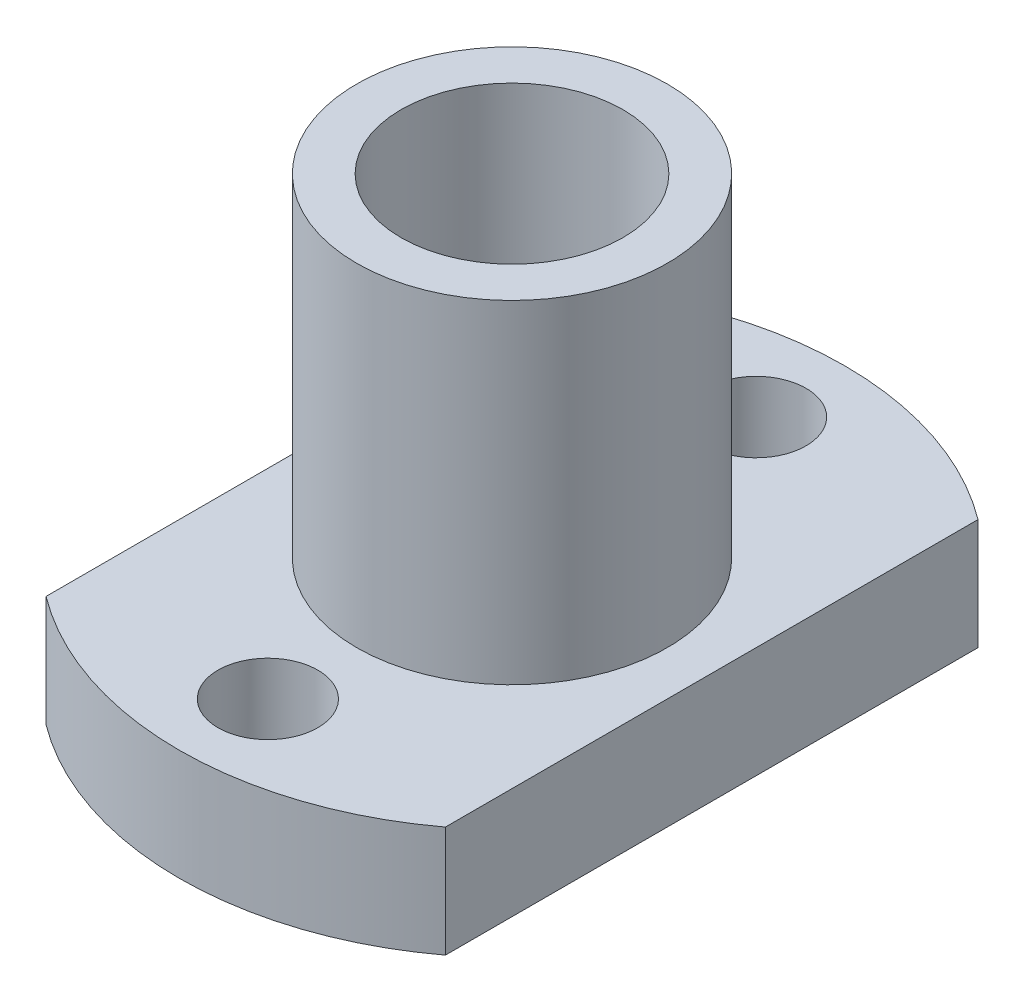
ISO-10303-21;
HEADER;
FILE_DESCRIPTION(('STEP AP214'),'2;1');
FILE_NAME('part.step','',(''),(''),'','','');
FILE_SCHEMA(('AUTOMOTIVE_DESIGN { 1 0 10303 214 1 1 1 1 }'));
ENDSEC;
DATA;
#1=APPLICATION_CONTEXT('core data for automotive mechanical design processes');
#2=APPLICATION_PROTOCOL_DEFINITION('international standard','automotive_design',2000,#1);
#3=PRODUCT_CONTEXT('',#1,'mechanical');
#4=PRODUCT('Part','Part','',(#3));
#5=PRODUCT_RELATED_PRODUCT_CATEGORY('part','',(#4));
#6=PRODUCT_DEFINITION_FORMATION('','',#4);
#7=PRODUCT_DEFINITION_CONTEXT('part definition',#1,'design');
#8=PRODUCT_DEFINITION('design','',#6,#7);
#9=PRODUCT_DEFINITION_SHAPE('','',#8);
#10=(LENGTH_UNIT() NAMED_UNIT(*) SI_UNIT(.MILLI.,.METRE.));
#11=(NAMED_UNIT(*) PLANE_ANGLE_UNIT() SI_UNIT($,.RADIAN.));
#12=(NAMED_UNIT(*) SI_UNIT($,.STERADIAN.) SOLID_ANGLE_UNIT());
#13=UNCERTAINTY_MEASURE_WITH_UNIT(LENGTH_MEASURE(1.E-05),#10,'distance_accuracy_value','');
#14=(GEOMETRIC_REPRESENTATION_CONTEXT(3) GLOBAL_UNCERTAINTY_ASSIGNED_CONTEXT((#13)) GLOBAL_UNIT_ASSIGNED_CONTEXT((#10,
#11,#12)) REPRESENTATION_CONTEXT('',''));
#15=CARTESIAN_POINT('',(0.,0.,0.));
#16=DIRECTION('',(0.,0.,1.));
#17=DIRECTION('',(1.,0.,0.));
#18=AXIS2_PLACEMENT_3D('',#15,#16,#17);
#19=CARTESIAN_POINT('',(0.,5.,0.));
#20=DIRECTION('',(0.,-1.,0.));
#21=DIRECTION('',(0.,0.,-1.));
#22=AXIS2_PLACEMENT_3D('',#19,#20,#21);
#23=CYLINDRICAL_SURFACE('',#22,15.);
#24=CARTESIAN_POINT('',(0.,0.,0.));
#25=DIRECTION('',(0.,1.,0.));
#26=DIRECTION('',(0.,0.,-1.));
#27=AXIS2_PLACEMENT_3D('',#24,#25,#26);
#28=CIRCLE('',#27,15.);
#29=CARTESIAN_POINT('',(9.,0.,-12.));
#30=VERTEX_POINT('',#29);
#31=CARTESIAN_POINT('',(-9.,0.,-12.));
#32=VERTEX_POINT('',#31);
#33=EDGE_CURVE('E107',#30,#32,#28,.T.);
#34=ORIENTED_EDGE('',*,*,#33,.T.);
#35=DIRECTION('',(0.,-1.,0.));
#36=VECTOR('',#35,1.);
#37=CARTESIAN_POINT('',(-9.,5.,-12.));
#38=LINE('',#37,#36);
#39=CARTESIAN_POINT('',(-9.,5.,-12.));
#40=VERTEX_POINT('',#39);
#41=EDGE_CURVE('E48',#40,#32,#38,.T.);
#42=ORIENTED_EDGE('',*,*,#41,.F.);
#43=CARTESIAN_POINT('',(0.,5.,0.));
#44=DIRECTION('',(0.,1.,0.));
#45=DIRECTION('',(0.,0.,-1.));
#46=AXIS2_PLACEMENT_3D('',#43,#44,#45);
#47=CIRCLE('',#46,15.);
#48=CARTESIAN_POINT('',(9.,5.,-12.));
#49=VERTEX_POINT('',#48);
#50=EDGE_CURVE('E93',#49,#40,#47,.T.);
#51=ORIENTED_EDGE('',*,*,#50,.F.);
#52=DIRECTION('',(0.,-1.,0.));
#53=VECTOR('',#52,1.);
#54=CARTESIAN_POINT('',(9.,5.,-12.));
#55=LINE('',#54,#53);
#56=EDGE_CURVE('E103',#49,#30,#55,.T.);
#57=ORIENTED_EDGE('',*,*,#56,.T.);
#58=EDGE_LOOP('',(#34,#42,#51,#57));
#59=FACE_BOUND('',#58,.T.);
#60=ADVANCED_FACE('F39',(#59),#23,.T.);
#61=CARTESIAN_POINT('',(-9.,5.,-12.));
#62=DIRECTION('',(1.,0.,0.));
#63=DIRECTION('',(0.,0.,-1.));
#64=AXIS2_PLACEMENT_3D('',#61,#62,#63);
#65=PLANE('',#64);
#66=DIRECTION('',(0.,0.,1.));
#67=VECTOR('',#66,1.);
#68=CARTESIAN_POINT('',(-9.,0.,-12.));
#69=LINE('',#68,#67);
#70=CARTESIAN_POINT('',(-9.,0.,12.));
#71=VERTEX_POINT('',#70);
#72=EDGE_CURVE('E98',#32,#71,#69,.T.);
#73=ORIENTED_EDGE('',*,*,#72,.T.);
#74=DIRECTION('',(0.,-1.,0.));
#75=VECTOR('',#74,1.);
#76=CARTESIAN_POINT('',(-9.,5.,12.));
#77=LINE('',#76,#75);
#78=CARTESIAN_POINT('',(-9.,5.,12.));
#79=VERTEX_POINT('',#78);
#80=EDGE_CURVE('E96',#79,#71,#77,.T.);
#81=ORIENTED_EDGE('',*,*,#80,.F.);
#82=DIRECTION('',(0.,0.,1.));
#83=VECTOR('',#82,1.);
#84=CARTESIAN_POINT('',(-9.,5.,-12.));
#85=LINE('',#84,#83);
#86=EDGE_CURVE('E88',#40,#79,#85,.T.);
#87=ORIENTED_EDGE('',*,*,#86,.F.);
#88=ORIENTED_EDGE('',*,*,#41,.T.);
#89=EDGE_LOOP('',(#73,#81,#87,#88));
#90=FACE_BOUND('',#89,.T.);
#91=ADVANCED_FACE('F97',(#90),#65,.F.);
#92=CARTESIAN_POINT('',(0.,5.,0.));
#93=DIRECTION('',(0.,-1.,0.));
#94=DIRECTION('',(0.,0.,-1.));
#95=AXIS2_PLACEMENT_3D('',#92,#93,#94);
#96=CYLINDRICAL_SURFACE('',#95,15.);
#97=CARTESIAN_POINT('',(0.,0.,0.));
#98=DIRECTION('',(0.,1.,0.));
#99=DIRECTION('',(0.,0.,1.));
#100=AXIS2_PLACEMENT_3D('',#97,#98,#99);
#101=CIRCLE('',#100,15.);
#102=CARTESIAN_POINT('',(9.,0.,12.));
#103=VERTEX_POINT('',#102);
#104=EDGE_CURVE('E74',#71,#103,#101,.T.);
#105=ORIENTED_EDGE('',*,*,#104,.T.);
#106=DIRECTION('',(0.,-1.,0.));
#107=VECTOR('',#106,1.);
#108=CARTESIAN_POINT('',(9.,5.,12.));
#109=LINE('',#108,#107);
#110=CARTESIAN_POINT('',(9.,5.,12.));
#111=VERTEX_POINT('',#110);
#112=EDGE_CURVE('E99',#111,#103,#109,.T.);
#113=ORIENTED_EDGE('',*,*,#112,.F.);
#114=CARTESIAN_POINT('',(0.,5.,0.));
#115=DIRECTION('',(0.,1.,0.));
#116=DIRECTION('',(0.,0.,1.));
#117=AXIS2_PLACEMENT_3D('',#114,#115,#116);
#118=CIRCLE('',#117,15.);
#119=EDGE_CURVE('E91',#79,#111,#118,.T.);
#120=ORIENTED_EDGE('',*,*,#119,.F.);
#121=ORIENTED_EDGE('',*,*,#80,.T.);
#122=EDGE_LOOP('',(#105,#113,#120,#121));
#123=FACE_BOUND('',#122,.T.);
#124=ADVANCED_FACE('F101',(#123),#96,.T.);
#125=CARTESIAN_POINT('',(9.,5.,-12.));
#126=DIRECTION('',(-1.,0.,0.));
#127=DIRECTION('',(0.,0.,1.));
#128=AXIS2_PLACEMENT_3D('',#125,#126,#127);
#129=PLANE('',#128);
#130=DIRECTION('',(0.,0.,-1.));
#131=VECTOR('',#130,1.);
#132=CARTESIAN_POINT('',(9.,0.,-12.));
#133=LINE('',#132,#131);
#134=EDGE_CURVE('E80',#103,#30,#133,.T.);
#135=ORIENTED_EDGE('',*,*,#134,.T.);
#136=ORIENTED_EDGE('',*,*,#56,.F.);
#137=DIRECTION('',(0.,0.,-1.));
#138=VECTOR('',#137,1.);
#139=CARTESIAN_POINT('',(9.,5.,-12.));
#140=LINE('',#139,#138);
#141=EDGE_CURVE('E57',#111,#49,#140,.T.);
#142=ORIENTED_EDGE('',*,*,#141,.F.);
#143=ORIENTED_EDGE('',*,*,#112,.T.);
#144=EDGE_LOOP('',(#135,#136,#142,#143));
#145=FACE_BOUND('',#144,.T.);
#146=ADVANCED_FACE('F149',(#145),#129,.F.);
#147=CARTESIAN_POINT('',(0.,5.,0.));
#148=DIRECTION('',(0.,-1.,0.));
#149=DIRECTION('',(0.,0.,-1.));
#150=AXIS2_PLACEMENT_3D('',#147,#148,#149);
#151=PLANE('',#150);
#152=CARTESIAN_POINT('',(0.,5.,-11.));
#153=DIRECTION('',(0.,1.,0.));
#154=DIRECTION('',(0.,0.,1.));
#155=AXIS2_PLACEMENT_3D('',#152,#153,#154);
#156=CIRCLE('',#155,2.25);
#157=CARTESIAN_POINT('',(0.,5.,-8.75));
#158=VERTEX_POINT('',#157);
#159=EDGE_CURVE('E118',#158,#158,#156,.T.);
#160=ORIENTED_EDGE('',*,*,#159,.F.);
#161=EDGE_LOOP('',(#160));
#162=FACE_BOUND('',#161,.T.);
#163=CARTESIAN_POINT('',(0.,5.,11.));
#164=DIRECTION('',(0.,1.,0.));
#165=DIRECTION('',(0.,0.,1.));
#166=AXIS2_PLACEMENT_3D('',#163,#164,#165);
#167=CIRCLE('',#166,2.25);
#168=CARTESIAN_POINT('',(0.,5.,13.25));
#169=VERTEX_POINT('',#168);
#170=EDGE_CURVE('E124',#169,#169,#167,.T.);
#171=ORIENTED_EDGE('',*,*,#170,.F.);
#172=EDGE_LOOP('',(#171));
#173=FACE_BOUND('',#172,.T.);
#174=CARTESIAN_POINT('',(0.,5.,0.));
#175=DIRECTION('',(0.,1.,0.));
#176=DIRECTION('',(0.,0.,1.));
#177=AXIS2_PLACEMENT_3D('',#174,#175,#176);
#178=CIRCLE('',#177,7.);
#179=CARTESIAN_POINT('',(0.,5.,7.));
#180=VERTEX_POINT('',#179);
#181=EDGE_CURVE('E11',#180,#180,#178,.T.);
#182=ORIENTED_EDGE('',*,*,#181,.F.);
#183=EDGE_LOOP('',(#182));
#184=FACE_BOUND('',#183,.T.);
#185=ORIENTED_EDGE('',*,*,#50,.T.);
#186=ORIENTED_EDGE('',*,*,#86,.T.);
#187=ORIENTED_EDGE('',*,*,#119,.T.);
#188=ORIENTED_EDGE('',*,*,#141,.T.);
#189=EDGE_LOOP('',(#185,#186,#187,#188));
#190=FACE_BOUND('',#189,.T.);
#191=ADVANCED_FACE('F89',(#162,#173,#184,#190),#151,.F.);
#192=CARTESIAN_POINT('',(0.,0.,0.));
#193=DIRECTION('',(0.,-1.,0.));
#194=DIRECTION('',(0.,0.,-1.));
#195=AXIS2_PLACEMENT_3D('',#192,#193,#194);
#196=PLANE('',#195);
#197=CARTESIAN_POINT('',(0.,0.,-11.));
#198=DIRECTION('',(0.,-1.,0.));
#199=DIRECTION('',(0.,0.,-1.));
#200=AXIS2_PLACEMENT_3D('',#197,#198,#199);
#201=CIRCLE('',#200,2.25);
#202=CARTESIAN_POINT('',(0.,0.,-13.25));
#203=VERTEX_POINT('',#202);
#204=EDGE_CURVE('E42',#203,#203,#201,.T.);
#205=ORIENTED_EDGE('',*,*,#204,.F.);
#206=EDGE_LOOP('',(#205));
#207=FACE_BOUND('',#206,.T.);
#208=CARTESIAN_POINT('',(0.,0.,11.));
#209=DIRECTION('',(0.,-1.,0.));
#210=DIRECTION('',(0.,0.,-1.));
#211=AXIS2_PLACEMENT_3D('',#208,#209,#210);
#212=CIRCLE('',#211,2.25);
#213=CARTESIAN_POINT('',(0.,0.,8.75));
#214=VERTEX_POINT('',#213);
#215=EDGE_CURVE('E116',#214,#214,#212,.T.);
#216=ORIENTED_EDGE('',*,*,#215,.F.);
#217=EDGE_LOOP('',(#216));
#218=FACE_BOUND('',#217,.T.);
#219=CARTESIAN_POINT('',(0.,0.,0.));
#220=DIRECTION('',(0.,-1.,0.));
#221=DIRECTION('',(0.,0.,-1.));
#222=AXIS2_PLACEMENT_3D('',#219,#220,#221);
#223=CIRCLE('',#222,5.);
#224=CARTESIAN_POINT('',(0.,0.,-5.));
#225=VERTEX_POINT('',#224);
#226=EDGE_CURVE('E133',#225,#225,#223,.T.);
#227=ORIENTED_EDGE('',*,*,#226,.F.);
#228=EDGE_LOOP('',(#227));
#229=FACE_BOUND('',#228,.T.);
#230=ORIENTED_EDGE('',*,*,#33,.F.);
#231=ORIENTED_EDGE('',*,*,#134,.F.);
#232=ORIENTED_EDGE('',*,*,#104,.F.);
#233=ORIENTED_EDGE('',*,*,#72,.F.);
#234=EDGE_LOOP('',(#230,#231,#232,#233));
#235=FACE_BOUND('',#234,.T.);
#236=ADVANCED_FACE('F144',(#207,#218,#229,#235),#196,.T.);
#237=CARTESIAN_POINT('',(0.,20.,0.));
#238=DIRECTION('',(0.,-1.,0.));
#239=DIRECTION('',(0.,0.,-1.));
#240=AXIS2_PLACEMENT_3D('',#237,#238,#239);
#241=CYLINDRICAL_SURFACE('',#240,7.);
#242=CARTESIAN_POINT('',(0.,20.,0.));
#243=DIRECTION('',(0.,1.,0.));
#244=DIRECTION('',(0.,0.,1.));
#245=AXIS2_PLACEMENT_3D('',#242,#243,#244);
#246=CIRCLE('',#245,7.);
#247=CARTESIAN_POINT('',(0.,20.,7.));
#248=VERTEX_POINT('',#247);
#249=EDGE_CURVE('E110',#248,#248,#246,.T.);
#250=ORIENTED_EDGE('',*,*,#249,.F.);
#251=EDGE_LOOP('',(#250));
#252=FACE_BOUND('',#251,.T.);
#253=ORIENTED_EDGE('',*,*,#181,.T.);
#254=EDGE_LOOP('',(#253));
#255=FACE_BOUND('',#254,.T.);
#256=ADVANCED_FACE('F141',(#252,#255),#241,.T.);
#257=CARTESIAN_POINT('',(0.,20.,0.));
#258=DIRECTION('',(0.,1.,0.));
#259=DIRECTION('',(0.,0.,1.));
#260=AXIS2_PLACEMENT_3D('',#257,#258,#259);
#261=PLANE('',#260);
#262=CARTESIAN_POINT('',(0.,20.,0.));
#263=DIRECTION('',(0.,1.,0.));
#264=DIRECTION('',(0.,0.,1.));
#265=AXIS2_PLACEMENT_3D('',#262,#263,#264);
#266=CIRCLE('',#265,5.);
#267=CARTESIAN_POINT('',(0.,20.,5.));
#268=VERTEX_POINT('',#267);
#269=EDGE_CURVE('E122',#268,#268,#266,.T.);
#270=ORIENTED_EDGE('',*,*,#269,.F.);
#271=EDGE_LOOP('',(#270));
#272=FACE_BOUND('',#271,.T.);
#273=ORIENTED_EDGE('',*,*,#249,.T.);
#274=EDGE_LOOP('',(#273));
#275=FACE_BOUND('',#274,.T.);
#276=ADVANCED_FACE('F139',(#272,#275),#261,.T.);
#277=CARTESIAN_POINT('',(0.,-10.,0.));
#278=DIRECTION('',(0.,1.,0.));
#279=DIRECTION('',(0.,0.,1.));
#280=AXIS2_PLACEMENT_3D('',#277,#278,#279);
#281=CYLINDRICAL_SURFACE('',#280,5.);
#282=ORIENTED_EDGE('',*,*,#226,.T.);
#283=EDGE_LOOP('',(#282));
#284=FACE_BOUND('',#283,.T.);
#285=ORIENTED_EDGE('',*,*,#269,.T.);
#286=EDGE_LOOP('',(#285));
#287=FACE_BOUND('',#286,.T.);
#288=ADVANCED_FACE('F196',(#284,#287),#281,.F.);
#289=CARTESIAN_POINT('',(0.,-25.,11.));
#290=DIRECTION('',(0.,1.,0.));
#291=DIRECTION('',(0.,0.,1.));
#292=AXIS2_PLACEMENT_3D('',#289,#290,#291);
#293=CYLINDRICAL_SURFACE('',#292,2.25);
#294=ORIENTED_EDGE('',*,*,#215,.T.);
#295=EDGE_LOOP('',(#294));
#296=FACE_BOUND('',#295,.T.);
#297=ORIENTED_EDGE('',*,*,#170,.T.);
#298=EDGE_LOOP('',(#297));
#299=FACE_BOUND('',#298,.T.);
#300=ADVANCED_FACE('F206',(#296,#299),#293,.F.);
#301=CARTESIAN_POINT('',(0.,-25.,-11.));
#302=DIRECTION('',(0.,1.,0.));
#303=DIRECTION('',(0.,0.,1.));
#304=AXIS2_PLACEMENT_3D('',#301,#302,#303);
#305=CYLINDRICAL_SURFACE('',#304,2.25);
#306=ORIENTED_EDGE('',*,*,#204,.T.);
#307=EDGE_LOOP('',(#306));
#308=FACE_BOUND('',#307,.T.);
#309=ORIENTED_EDGE('',*,*,#159,.T.);
#310=EDGE_LOOP('',(#309));
#311=FACE_BOUND('',#310,.T.);
#312=ADVANCED_FACE('F228',(#308,#311),#305,.F.);
#313=CLOSED_SHELL('',(#60,#91,#124,#146,#191,#236,#256,#276,#288,#300,#312));
#314=MANIFOLD_SOLID_BREP('B2',#313);
#315=ADVANCED_BREP_SHAPE_REPRESENTATION('',(#18,#314),#14);
#316=SHAPE_DEFINITION_REPRESENTATION(#9,#315);
ENDSEC;
END-ISO-10303-21;
